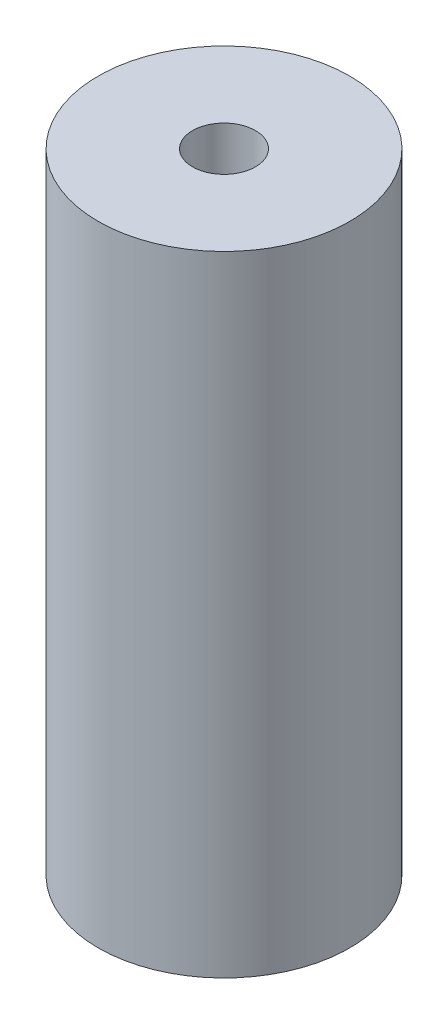
ISO-10303-21;
HEADER;
FILE_DESCRIPTION(('STEP AP214'),'2;1');
FILE_NAME('part.step','',(''),(''),'','','');
FILE_SCHEMA(('AUTOMOTIVE_DESIGN { 1 0 10303 214 1 1 1 1 }'));
ENDSEC;
DATA;
#1=APPLICATION_CONTEXT('core data for automotive mechanical design processes');
#2=APPLICATION_PROTOCOL_DEFINITION('international standard','automotive_design',2000,#1);
#3=PRODUCT_CONTEXT('',#1,'mechanical');
#4=PRODUCT('Part','Part','',(#3));
#5=PRODUCT_RELATED_PRODUCT_CATEGORY('part','',(#4));
#6=PRODUCT_DEFINITION_FORMATION('','',#4);
#7=PRODUCT_DEFINITION_CONTEXT('part definition',#1,'design');
#8=PRODUCT_DEFINITION('design','',#6,#7);
#9=PRODUCT_DEFINITION_SHAPE('','',#8);
#10=(LENGTH_UNIT() NAMED_UNIT(*) SI_UNIT(.MILLI.,.METRE.));
#11=(NAMED_UNIT(*) PLANE_ANGLE_UNIT() SI_UNIT($,.RADIAN.));
#12=(NAMED_UNIT(*) SI_UNIT($,.STERADIAN.) SOLID_ANGLE_UNIT());
#13=UNCERTAINTY_MEASURE_WITH_UNIT(LENGTH_MEASURE(1.E-05),#10,'distance_accuracy_value','');
#14=(GEOMETRIC_REPRESENTATION_CONTEXT(3) GLOBAL_UNCERTAINTY_ASSIGNED_CONTEXT((#13)) GLOBAL_UNIT_ASSIGNED_CONTEXT((#10,
#11,#12)) REPRESENTATION_CONTEXT('',''));
#15=CARTESIAN_POINT('',(0.,0.,0.));
#16=DIRECTION('',(0.,0.,1.));
#17=DIRECTION('',(1.,0.,0.));
#18=AXIS2_PLACEMENT_3D('',#15,#16,#17);
#19=CARTESIAN_POINT('',(0.,200.,0.));
#20=DIRECTION('',(0.,-1.,0.));
#21=DIRECTION('',(0.,0.,-1.));
#22=AXIS2_PLACEMENT_3D('',#19,#20,#21);
#23=CYLINDRICAL_SURFACE('',#22,40.);
#24=CARTESIAN_POINT('',(0.,200.,0.));
#25=DIRECTION('',(0.,1.,0.));
#26=DIRECTION('',(0.,0.,1.));
#27=AXIS2_PLACEMENT_3D('',#24,#25,#26);
#28=CIRCLE('',#27,40.);
#29=CARTESIAN_POINT('',(0.,200.,40.));
#30=VERTEX_POINT('',#29);
#31=EDGE_CURVE('E10',#30,#30,#28,.T.);
#32=ORIENTED_EDGE('',*,*,#31,.F.);
#33=EDGE_LOOP('',(#32));
#34=FACE_BOUND('',#33,.T.);
#35=CARTESIAN_POINT('',(0.,0.,0.));
#36=DIRECTION('',(0.,1.,0.));
#37=DIRECTION('',(0.,0.,1.));
#38=AXIS2_PLACEMENT_3D('',#35,#36,#37);
#39=CIRCLE('',#38,40.);
#40=CARTESIAN_POINT('',(0.,0.,40.));
#41=VERTEX_POINT('',#40);
#42=EDGE_CURVE('E40',#41,#41,#39,.T.);
#43=ORIENTED_EDGE('',*,*,#42,.T.);
#44=EDGE_LOOP('',(#43));
#45=FACE_BOUND('',#44,.T.);
#46=ADVANCED_FACE('F37',(#34,#45),#23,.T.);
#47=CARTESIAN_POINT('',(0.,200.,0.));
#48=DIRECTION('',(0.,1.,0.));
#49=DIRECTION('',(0.,0.,1.));
#50=AXIS2_PLACEMENT_3D('',#47,#48,#49);
#51=PLANE('',#50);
#52=CARTESIAN_POINT('',(0.,200.,0.));
#53=DIRECTION('',(0.,1.,0.));
#54=DIRECTION('',(0.,0.,1.));
#55=AXIS2_PLACEMENT_3D('',#52,#53,#54);
#56=CIRCLE('',#55,10.);
#57=CARTESIAN_POINT('',(0.,200.,10.));
#58=VERTEX_POINT('',#57);
#59=EDGE_CURVE('E51',#58,#58,#56,.T.);
#60=ORIENTED_EDGE('',*,*,#59,.F.);
#61=EDGE_LOOP('',(#60));
#62=FACE_BOUND('',#61,.T.);
#63=ORIENTED_EDGE('',*,*,#31,.T.);
#64=EDGE_LOOP('',(#63));
#65=FACE_BOUND('',#64,.T.);
#66=ADVANCED_FACE('F68',(#62,#65),#51,.T.);
#67=CARTESIAN_POINT('',(0.,0.,0.));
#68=DIRECTION('',(0.,1.,0.));
#69=DIRECTION('',(0.,0.,1.));
#70=AXIS2_PLACEMENT_3D('',#67,#68,#69);
#71=PLANE('',#70);
#72=CARTESIAN_POINT('',(0.,0.,0.));
#73=DIRECTION('',(0.,1.,0.));
#74=DIRECTION('',(0.,0.,1.));
#75=AXIS2_PLACEMENT_3D('',#72,#73,#74);
#76=CIRCLE('',#75,10.);
#77=CARTESIAN_POINT('',(0.,0.,10.));
#78=VERTEX_POINT('',#77);
#79=EDGE_CURVE('E49',#78,#78,#76,.T.);
#80=ORIENTED_EDGE('',*,*,#79,.T.);
#81=EDGE_LOOP('',(#80));
#82=FACE_BOUND('',#81,.T.);
#83=ORIENTED_EDGE('',*,*,#42,.F.);
#84=EDGE_LOOP('',(#83));
#85=FACE_BOUND('',#84,.T.);
#86=ADVANCED_FACE('F59',(#82,#85),#71,.F.);
#87=CARTESIAN_POINT('',(0.,0.,0.));
#88=DIRECTION('',(0.,1.,0.));
#89=DIRECTION('',(0.,0.,1.));
#90=AXIS2_PLACEMENT_3D('',#87,#88,#89);
#91=CYLINDRICAL_SURFACE('',#90,10.);
#92=ORIENTED_EDGE('',*,*,#79,.F.);
#93=EDGE_LOOP('',(#92));
#94=FACE_BOUND('',#93,.T.);
#95=ORIENTED_EDGE('',*,*,#59,.T.);
#96=EDGE_LOOP('',(#95));
#97=FACE_BOUND('',#96,.T.);
#98=ADVANCED_FACE('F62',(#94,#97),#91,.F.);
#99=CLOSED_SHELL('',(#46,#66,#86,#98));
#100=MANIFOLD_SOLID_BREP('B2',#99);
#101=ADVANCED_BREP_SHAPE_REPRESENTATION('',(#18,#100),#14);
#102=SHAPE_DEFINITION_REPRESENTATION(#9,#101);
ENDSEC;
END-ISO-10303-21;
